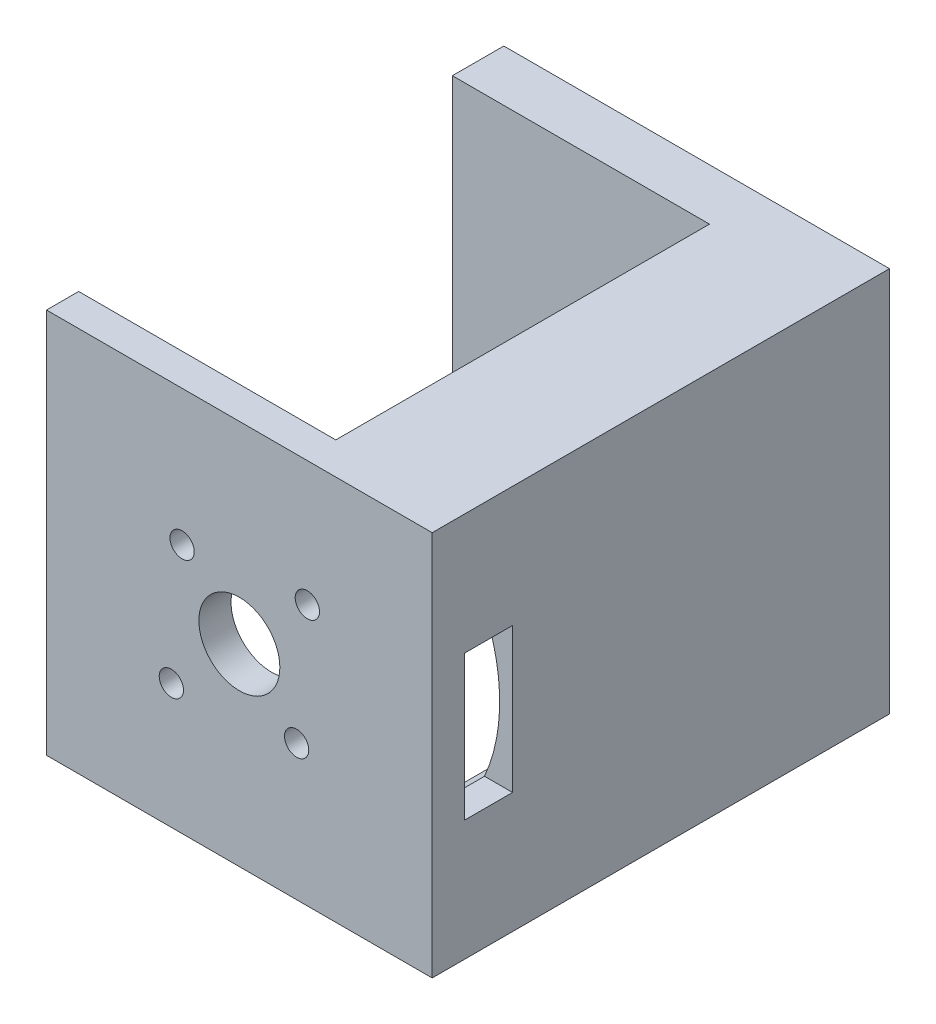
ISO-10303-21;
HEADER;
FILE_DESCRIPTION(('STEP AP214'),'2;1');
FILE_NAME('part.step','',(''),(''),'','','');
FILE_SCHEMA(('AUTOMOTIVE_DESIGN { 1 0 10303 214 1 1 1 1 }'));
ENDSEC;
DATA;
#1=APPLICATION_CONTEXT('core data for automotive mechanical design processes');
#2=APPLICATION_PROTOCOL_DEFINITION('international standard','automotive_design',2000,#1);
#3=PRODUCT_CONTEXT('',#1,'mechanical');
#4=PRODUCT('Part','Part','',(#3));
#5=PRODUCT_RELATED_PRODUCT_CATEGORY('part','',(#4));
#6=PRODUCT_DEFINITION_FORMATION('','',#4);
#7=PRODUCT_DEFINITION_CONTEXT('part definition',#1,'design');
#8=PRODUCT_DEFINITION('design','',#6,#7);
#9=PRODUCT_DEFINITION_SHAPE('','',#8);
#10=(LENGTH_UNIT() NAMED_UNIT(*) SI_UNIT(.MILLI.,.METRE.));
#11=(NAMED_UNIT(*) PLANE_ANGLE_UNIT() SI_UNIT($,.RADIAN.));
#12=(NAMED_UNIT(*) SI_UNIT($,.STERADIAN.) SOLID_ANGLE_UNIT());
#13=UNCERTAINTY_MEASURE_WITH_UNIT(LENGTH_MEASURE(1.E-05),#10,'distance_accuracy_value','');
#14=(GEOMETRIC_REPRESENTATION_CONTEXT(3) GLOBAL_UNCERTAINTY_ASSIGNED_CONTEXT((#13)) GLOBAL_UNIT_ASSIGNED_CONTEXT((#10,
#11,#12)) REPRESENTATION_CONTEXT('',''));
#15=CARTESIAN_POINT('',(0.,0.,0.));
#16=DIRECTION('',(0.,0.,1.));
#17=DIRECTION('',(1.,0.,0.));
#18=AXIS2_PLACEMENT_3D('',#15,#16,#17);
#19=CARTESIAN_POINT('',(0.,0.,3.175));
#20=DIRECTION('',(0.,0.,1.));
#21=DIRECTION('',(1.,0.,0.));
#22=AXIS2_PLACEMENT_3D('',#19,#20,#21);
#23=PLANE('',#22);
#24=CARTESIAN_POINT('',(-5.656854249492,5.656854249493,3.175));
#25=DIRECTION('',(0.,0.,1.));
#26=DIRECTION('',(1.,0.,0.));
#27=AXIS2_PLACEMENT_3D('',#24,#25,#26);
#28=CIRCLE('',#27,1.2);
#29=CARTESIAN_POINT('',(-4.456854249492,5.656854249493,3.175));
#30=VERTEX_POINT('',#29);
#31=EDGE_CURVE('E236',#30,#30,#28,.T.);
#32=ORIENTED_EDGE('',*,*,#31,.F.);
#33=EDGE_LOOP('',(#32));
#34=FACE_BOUND('',#33,.T.);
#35=CARTESIAN_POINT('',(5.656854249492,-5.656854249492,3.175));
#36=DIRECTION('',(0.,0.,1.));
#37=DIRECTION('',(1.,0.,0.));
#38=AXIS2_PLACEMENT_3D('',#35,#36,#37);
#39=CIRCLE('',#38,1.2);
#40=CARTESIAN_POINT('',(6.856854249492,-5.656854249492,3.175));
#41=VERTEX_POINT('',#40);
#42=EDGE_CURVE('E248',#41,#41,#39,.T.);
#43=ORIENTED_EDGE('',*,*,#42,.F.);
#44=EDGE_LOOP('',(#43));
#45=FACE_BOUND('',#44,.T.);
#46=DIRECTION('',(0.,-1.,0.));
#47=VECTOR('',#46,1.);
#48=CARTESIAN_POINT('',(-19.05,19.05,3.175));
#49=LINE('',#48,#47);
#50=CARTESIAN_POINT('',(-19.05,19.05,3.175));
#51=VERTEX_POINT('',#50);
#52=CARTESIAN_POINT('',(-19.05,-19.05,3.175));
#53=VERTEX_POINT('',#52);
#54=EDGE_CURVE('E260',#51,#53,#49,.T.);
#55=ORIENTED_EDGE('',*,*,#54,.T.);
#56=DIRECTION('',(1.,0.,0.));
#57=VECTOR('',#56,1.);
#58=CARTESIAN_POINT('',(-19.05,-19.05,3.175));
#59=LINE('',#58,#57);
#60=CARTESIAN_POINT('',(19.05,-19.05,3.175));
#61=VERTEX_POINT('',#60);
#62=EDGE_CURVE('E263',#53,#61,#59,.T.);
#63=ORIENTED_EDGE('',*,*,#62,.T.);
#64=DIRECTION('',(0.,1.,0.));
#65=VECTOR('',#64,1.);
#66=CARTESIAN_POINT('',(19.05,19.05,3.175));
#67=LINE('',#66,#65);
#68=CARTESIAN_POINT('',(19.05,19.05,3.175));
#69=VERTEX_POINT('',#68);
#70=EDGE_CURVE('E266',#61,#69,#67,.T.);
#71=ORIENTED_EDGE('',*,*,#70,.T.);
#72=DIRECTION('',(-1.,0.,0.));
#73=VECTOR('',#72,1.);
#74=CARTESIAN_POINT('',(-19.05,19.05,3.175));
#75=LINE('',#74,#73);
#76=EDGE_CURVE('E268',#69,#51,#75,.T.);
#77=ORIENTED_EDGE('',*,*,#76,.T.);
#78=EDGE_LOOP('',(#55,#63,#71,#77));
#79=FACE_BOUND('',#78,.T.);
#80=CARTESIAN_POINT('',(6.717514421273,6.717514421272,3.175));
#81=DIRECTION('',(0.,0.,1.));
#82=DIRECTION('',(1.,0.,0.));
#83=AXIS2_PLACEMENT_3D('',#80,#81,#82);
#84=CIRCLE('',#83,1.2);
#85=CARTESIAN_POINT('',(7.917514421273,6.717514421272,3.175));
#86=VERTEX_POINT('',#85);
#87=EDGE_CURVE('E254',#86,#86,#84,.T.);
#88=ORIENTED_EDGE('',*,*,#87,.F.);
#89=EDGE_LOOP('',(#88));
#90=FACE_BOUND('',#89,.T.);
#91=CARTESIAN_POINT('',(-6.717514421272,-6.717514421272,3.175));
#92=DIRECTION('',(0.,0.,1.));
#93=DIRECTION('',(1.,0.,0.));
#94=AXIS2_PLACEMENT_3D('',#91,#92,#93);
#95=CIRCLE('',#94,1.2);
#96=CARTESIAN_POINT('',(-5.517514421272,-6.717514421272,3.175));
#97=VERTEX_POINT('',#96);
#98=EDGE_CURVE('E242',#97,#97,#95,.T.);
#99=ORIENTED_EDGE('',*,*,#98,.F.);
#100=EDGE_LOOP('',(#99));
#101=FACE_BOUND('',#100,.T.);
#102=CARTESIAN_POINT('',(0.,0.,3.175));
#103=DIRECTION('',(0.,0.,1.));
#104=DIRECTION('',(1.,0.,0.));
#105=AXIS2_PLACEMENT_3D('',#102,#103,#104);
#106=CIRCLE('',#105,4.);
#107=CARTESIAN_POINT('',(4.,0.,3.175));
#108=VERTEX_POINT('',#107);
#109=EDGE_CURVE('E230',#108,#108,#106,.T.);
#110=ORIENTED_EDGE('',*,*,#109,.F.);
#111=EDGE_LOOP('',(#110));
#112=FACE_BOUND('',#111,.T.);
#113=ADVANCED_FACE('F43',(#34,#45,#79,#90,#101,#112),#23,.T.);
#114=CARTESIAN_POINT('',(0.,0.,0.));
#115=DIRECTION('',(0.,0.,1.));
#116=DIRECTION('',(1.,0.,0.));
#117=AXIS2_PLACEMENT_3D('',#114,#115,#116);
#118=PLANE('',#117);
#119=CARTESIAN_POINT('',(6.717514421273,6.717514421272,0.));
#120=DIRECTION('',(0.,0.,1.));
#121=DIRECTION('',(1.,0.,0.));
#122=AXIS2_PLACEMENT_3D('',#119,#120,#121);
#123=CIRCLE('',#122,1.2);
#124=CARTESIAN_POINT('',(7.917514421273,6.717514421272,0.));
#125=VERTEX_POINT('',#124);
#126=EDGE_CURVE('E251',#125,#125,#123,.T.);
#127=ORIENTED_EDGE('',*,*,#126,.T.);
#128=EDGE_LOOP('',(#127));
#129=FACE_BOUND('',#128,.T.);
#130=CARTESIAN_POINT('',(-6.717514421272,-6.717514421272,0.));
#131=DIRECTION('',(0.,0.,1.));
#132=DIRECTION('',(1.,0.,0.));
#133=AXIS2_PLACEMENT_3D('',#130,#131,#132);
#134=CIRCLE('',#133,1.2);
#135=CARTESIAN_POINT('',(-5.517514421272,-6.717514421272,0.));
#136=VERTEX_POINT('',#135);
#137=EDGE_CURVE('E239',#136,#136,#134,.T.);
#138=ORIENTED_EDGE('',*,*,#137,.T.);
#139=EDGE_LOOP('',(#138));
#140=FACE_BOUND('',#139,.T.);
#141=DIRECTION('',(1.,0.,0.));
#142=VECTOR('',#141,1.);
#143=CARTESIAN_POINT('',(-19.05,-19.05,0.));
#144=LINE('',#143,#142);
#145=CARTESIAN_POINT('',(-19.05,-19.05,0.));
#146=VERTEX_POINT('',#145);
#147=CARTESIAN_POINT('',(6.35000000000006,-19.05,0.));
#148=VERTEX_POINT('',#147);
#149=EDGE_CURVE('E272',#146,#148,#144,.T.);
#150=ORIENTED_EDGE('',*,*,#149,.F.);
#151=DIRECTION('',(0.,-1.,0.));
#152=VECTOR('',#151,1.);
#153=CARTESIAN_POINT('',(-19.05,19.05,0.));
#154=LINE('',#153,#152);
#155=CARTESIAN_POINT('',(-19.05,19.05,0.));
#156=VERTEX_POINT('',#155);
#157=EDGE_CURVE('E257',#156,#146,#154,.T.);
#158=ORIENTED_EDGE('',*,*,#157,.F.);
#159=DIRECTION('',(-1.,0.,0.));
#160=VECTOR('',#159,1.);
#161=CARTESIAN_POINT('',(-19.05,19.05,0.));
#162=LINE('',#161,#160);
#163=CARTESIAN_POINT('',(6.35,19.05,0.));
#164=VERTEX_POINT('',#163);
#165=EDGE_CURVE('E264',#164,#156,#162,.T.);
#166=ORIENTED_EDGE('',*,*,#165,.F.);
#167=DIRECTION('',(0.,1.,0.));
#168=VECTOR('',#167,1.);
#169=CARTESIAN_POINT('',(6.35000000000001,0.,0.));
#170=LINE('',#169,#168);
#171=CARTESIAN_POINT('',(6.35,16.60740497489,0.));
#172=VERTEX_POINT('',#171);
#173=EDGE_CURVE('E205',#172,#164,#170,.T.);
#174=ORIENTED_EDGE('',*,*,#173,.F.);
#175=CARTESIAN_POINT('',(0.,0.,0.));
#176=DIRECTION('',(0.,0.,-1.));
#177=DIRECTION('',(-1.,0.,0.));
#178=AXIS2_PLACEMENT_3D('',#175,#176,#177);
#179=CIRCLE('',#178,17.78);
#180=CARTESIAN_POINT('',(16.2817454819039,7.14375,0.));
#181=VERTEX_POINT('',#180);
#182=EDGE_CURVE('E204',#172,#181,#179,.T.);
#183=ORIENTED_EDGE('',*,*,#182,.T.);
#184=DIRECTION('',(1.,0.,0.));
#185=VECTOR('',#184,1.);
#186=CARTESIAN_POINT('',(-19.05,7.14375,0.));
#187=LINE('',#186,#185);
#188=CARTESIAN_POINT('',(19.05,7.14375,0.));
#189=VERTEX_POINT('',#188);
#190=EDGE_CURVE('E166',#181,#189,#187,.T.);
#191=ORIENTED_EDGE('',*,*,#190,.T.);
#192=DIRECTION('',(0.,-1.,0.));
#193=VECTOR('',#192,1.);
#194=CARTESIAN_POINT('',(19.05,7.14375,0.));
#195=LINE('',#194,#193);
#196=CARTESIAN_POINT('',(19.05,-7.14375,0.));
#197=VERTEX_POINT('',#196);
#198=EDGE_CURVE('E58',#189,#197,#195,.T.);
#199=ORIENTED_EDGE('',*,*,#198,.T.);
#200=DIRECTION('',(1.,0.,0.));
#201=VECTOR('',#200,1.);
#202=CARTESIAN_POINT('',(-19.05,-7.14375,0.));
#203=LINE('',#202,#201);
#204=CARTESIAN_POINT('',(16.2817454819039,-7.14375,0.));
#205=VERTEX_POINT('',#204);
#206=EDGE_CURVE('E151',#205,#197,#203,.T.);
#207=ORIENTED_EDGE('',*,*,#206,.F.);
#208=CARTESIAN_POINT('',(6.35000000000006,-16.6074049748899,0.));
#209=VERTEX_POINT('',#208);
#210=EDGE_CURVE('E212',#205,#209,#179,.T.);
#211=ORIENTED_EDGE('',*,*,#210,.T.);
#212=DIRECTION('',(0.,-1.,0.));
#213=VECTOR('',#212,1.);
#214=CARTESIAN_POINT('',(6.35000000000007,0.,0.));
#215=LINE('',#214,#213);
#216=EDGE_CURVE('E201',#209,#148,#215,.T.);
#217=ORIENTED_EDGE('',*,*,#216,.T.);
#218=EDGE_LOOP('',(#150,#158,#166,#174,#183,#191,#199,#207,#211,#217));
#219=FACE_BOUND('',#218,.T.);
#220=CARTESIAN_POINT('',(5.656854249492,-5.656854249492,0.));
#221=DIRECTION('',(0.,0.,1.));
#222=DIRECTION('',(1.,0.,0.));
#223=AXIS2_PLACEMENT_3D('',#220,#221,#222);
#224=CIRCLE('',#223,1.2);
#225=CARTESIAN_POINT('',(6.856854249492,-5.656854249492,0.));
#226=VERTEX_POINT('',#225);
#227=EDGE_CURVE('E245',#226,#226,#224,.T.);
#228=ORIENTED_EDGE('',*,*,#227,.T.);
#229=EDGE_LOOP('',(#228));
#230=FACE_BOUND('',#229,.T.);
#231=CARTESIAN_POINT('',(-5.656854249492,5.656854249493,0.));
#232=DIRECTION('',(0.,0.,1.));
#233=DIRECTION('',(1.,0.,0.));
#234=AXIS2_PLACEMENT_3D('',#231,#232,#233);
#235=CIRCLE('',#234,1.2);
#236=CARTESIAN_POINT('',(-4.456854249492,5.656854249493,0.));
#237=VERTEX_POINT('',#236);
#238=EDGE_CURVE('E233',#237,#237,#235,.T.);
#239=ORIENTED_EDGE('',*,*,#238,.T.);
#240=EDGE_LOOP('',(#239));
#241=FACE_BOUND('',#240,.T.);
#242=CARTESIAN_POINT('',(0.,0.,0.));
#243=DIRECTION('',(0.,0.,1.));
#244=DIRECTION('',(1.,0.,0.));
#245=AXIS2_PLACEMENT_3D('',#242,#243,#244);
#246=CIRCLE('',#245,4.);
#247=CARTESIAN_POINT('',(4.,0.,0.));
#248=VERTEX_POINT('',#247);
#249=EDGE_CURVE('E229',#248,#248,#246,.T.);
#250=ORIENTED_EDGE('',*,*,#249,.T.);
#251=EDGE_LOOP('',(#250));
#252=FACE_BOUND('',#251,.T.);
#253=ADVANCED_FACE('F289',(#129,#140,#219,#230,#241,#252),#118,.F.);
#254=CARTESIAN_POINT('',(-19.05,19.05,3.175));
#255=DIRECTION('',(1.,0.,0.));
#256=DIRECTION('',(0.,1.,0.));
#257=AXIS2_PLACEMENT_3D('',#254,#255,#256);
#258=PLANE('',#257);
#259=ORIENTED_EDGE('',*,*,#157,.T.);
#260=DIRECTION('',(0.,0.,-1.));
#261=VECTOR('',#260,1.);
#262=CARTESIAN_POINT('',(-19.05,-19.05,3.175));
#263=LINE('',#262,#261);
#264=EDGE_CURVE('E282',#53,#146,#263,.T.);
#265=ORIENTED_EDGE('',*,*,#264,.F.);
#266=ORIENTED_EDGE('',*,*,#54,.F.);
#267=DIRECTION('',(0.,0.,-1.));
#268=VECTOR('',#267,1.);
#269=CARTESIAN_POINT('',(-19.05,19.05,3.175));
#270=LINE('',#269,#268);
#271=EDGE_CURVE('E270',#51,#156,#270,.T.);
#272=ORIENTED_EDGE('',*,*,#271,.T.);
#273=EDGE_LOOP('',(#259,#265,#266,#272));
#274=FACE_BOUND('',#273,.T.);
#275=ADVANCED_FACE('F45',(#274),#258,.F.);
#276=CARTESIAN_POINT('',(-19.05,-19.05,3.175));
#277=DIRECTION('',(0.,1.,0.));
#278=DIRECTION('',(0.,0.,1.));
#279=AXIS2_PLACEMENT_3D('',#276,#277,#278);
#280=PLANE('',#279);
#281=ORIENTED_EDGE('',*,*,#149,.T.);
#282=DIRECTION('',(0.,0.,1.));
#283=VECTOR('',#282,1.);
#284=CARTESIAN_POINT('',(6.35000000000006,-19.05,-82.1609262841384));
#285=LINE('',#284,#283);
#286=CARTESIAN_POINT('',(6.35000000000006,-19.05,-36.92));
#287=VERTEX_POINT('',#286);
#288=EDGE_CURVE('E215',#287,#148,#285,.T.);
#289=ORIENTED_EDGE('',*,*,#288,.F.);
#290=DIRECTION('',(1.,0.,0.));
#291=VECTOR('',#290,1.);
#292=CARTESIAN_POINT('',(0.,-19.05,-36.92));
#293=LINE('',#292,#291);
#294=CARTESIAN_POINT('',(-19.05,-19.05,-36.92));
#295=VERTEX_POINT('',#294);
#296=EDGE_CURVE('E189',#295,#287,#293,.T.);
#297=ORIENTED_EDGE('',*,*,#296,.F.);
#298=DIRECTION('',(0.,0.,1.));
#299=VECTOR('',#298,1.);
#300=CARTESIAN_POINT('',(-19.05,-19.05,-42.));
#301=LINE('',#300,#299);
#302=CARTESIAN_POINT('',(-19.05,-19.05,-42.));
#303=VERTEX_POINT('',#302);
#304=EDGE_CURVE('E198',#303,#295,#301,.T.);
#305=ORIENTED_EDGE('',*,*,#304,.F.);
#306=DIRECTION('',(1.,0.,0.));
#307=VECTOR('',#306,1.);
#308=CARTESIAN_POINT('',(0.,-19.05,-42.));
#309=LINE('',#308,#307);
#310=CARTESIAN_POINT('',(19.05,-19.05,-42.));
#311=VERTEX_POINT('',#310);
#312=EDGE_CURVE('E178',#303,#311,#309,.T.);
#313=ORIENTED_EDGE('',*,*,#312,.T.);
#314=DIRECTION('',(0.,0.,-1.));
#315=VECTOR('',#314,1.);
#316=CARTESIAN_POINT('',(19.05,-19.05,3.175));
#317=LINE('',#316,#315);
#318=EDGE_CURVE('E280',#61,#311,#317,.T.);
#319=ORIENTED_EDGE('',*,*,#318,.F.);
#320=ORIENTED_EDGE('',*,*,#62,.F.);
#321=ORIENTED_EDGE('',*,*,#264,.T.);
#322=EDGE_LOOP('',(#281,#289,#297,#305,#313,#319,#320,#321));
#323=FACE_BOUND('',#322,.T.);
#324=ADVANCED_FACE('F301',(#323),#280,.F.);
#325=CARTESIAN_POINT('',(19.05,19.05,3.175));
#326=DIRECTION('',(-1.,0.,0.));
#327=DIRECTION('',(0.,0.,1.));
#328=AXIS2_PLACEMENT_3D('',#325,#326,#327);
#329=PLANE('',#328);
#330=DIRECTION('',(0.,0.,-1.));
#331=VECTOR('',#330,1.);
#332=CARTESIAN_POINT('',(19.05,-7.14375,0.));
#333=LINE('',#332,#331);
#334=CARTESIAN_POINT('',(19.05,-7.14375,-4.7625));
#335=VERTEX_POINT('',#334);
#336=EDGE_CURVE('E154',#197,#335,#333,.T.);
#337=ORIENTED_EDGE('',*,*,#336,.F.);
#338=ORIENTED_EDGE('',*,*,#198,.F.);
#339=DIRECTION('',(0.,0.,1.));
#340=VECTOR('',#339,1.);
#341=CARTESIAN_POINT('',(19.05,7.14375,0.));
#342=LINE('',#341,#340);
#343=CARTESIAN_POINT('',(19.05,7.14375,-4.7625));
#344=VERTEX_POINT('',#343);
#345=EDGE_CURVE('E161',#344,#189,#342,.T.);
#346=ORIENTED_EDGE('',*,*,#345,.F.);
#347=DIRECTION('',(0.,1.,0.));
#348=VECTOR('',#347,1.);
#349=CARTESIAN_POINT('',(19.05,7.14375,-4.7625));
#350=LINE('',#349,#348);
#351=EDGE_CURVE('E146',#335,#344,#350,.T.);
#352=ORIENTED_EDGE('',*,*,#351,.F.);
#353=EDGE_LOOP('',(#337,#338,#346,#352));
#354=FACE_BOUND('',#353,.T.);
#355=ORIENTED_EDGE('',*,*,#318,.T.);
#356=DIRECTION('',(0.,-1.,0.));
#357=VECTOR('',#356,1.);
#358=CARTESIAN_POINT('',(19.05,0.,-42.));
#359=LINE('',#358,#357);
#360=CARTESIAN_POINT('',(19.05,19.05,-42.));
#361=VERTEX_POINT('',#360);
#362=EDGE_CURVE('E174',#361,#311,#359,.T.);
#363=ORIENTED_EDGE('',*,*,#362,.F.);
#364=DIRECTION('',(0.,0.,-1.));
#365=VECTOR('',#364,1.);
#366=CARTESIAN_POINT('',(19.05,19.05,3.175));
#367=LINE('',#366,#365);
#368=EDGE_CURVE('E278',#69,#361,#367,.T.);
#369=ORIENTED_EDGE('',*,*,#368,.F.);
#370=ORIENTED_EDGE('',*,*,#70,.F.);
#371=EDGE_LOOP('',(#355,#363,#369,#370));
#372=FACE_BOUND('',#371,.T.);
#373=ADVANCED_FACE('F158',(#354,#372),#329,.F.);
#374=CARTESIAN_POINT('',(-19.05,19.05,3.175));
#375=DIRECTION('',(0.,-1.,0.));
#376=DIRECTION('',(0.,0.,-1.));
#377=AXIS2_PLACEMENT_3D('',#374,#375,#376);
#378=PLANE('',#377);
#379=ORIENTED_EDGE('',*,*,#368,.T.);
#380=DIRECTION('',(-1.,0.,0.));
#381=VECTOR('',#380,1.);
#382=CARTESIAN_POINT('',(0.,19.05,-42.));
#383=LINE('',#382,#381);
#384=CARTESIAN_POINT('',(-19.05,19.05,-42.));
#385=VERTEX_POINT('',#384);
#386=EDGE_CURVE('E171',#361,#385,#383,.T.);
#387=ORIENTED_EDGE('',*,*,#386,.T.);
#388=DIRECTION('',(0.,0.,1.));
#389=VECTOR('',#388,1.);
#390=CARTESIAN_POINT('',(-19.05,19.05,-42.));
#391=LINE('',#390,#389);
#392=CARTESIAN_POINT('',(-19.05,19.05,-36.92));
#393=VERTEX_POINT('',#392);
#394=EDGE_CURVE('E187',#385,#393,#391,.T.);
#395=ORIENTED_EDGE('',*,*,#394,.T.);
#396=DIRECTION('',(-1.,0.,0.));
#397=VECTOR('',#396,1.);
#398=CARTESIAN_POINT('',(0.,19.05,-36.92));
#399=LINE('',#398,#397);
#400=CARTESIAN_POINT('',(6.35,19.05,-36.92));
#401=VERTEX_POINT('',#400);
#402=EDGE_CURVE('E168',#401,#393,#399,.T.);
#403=ORIENTED_EDGE('',*,*,#402,.F.);
#404=DIRECTION('',(0.,0.,1.));
#405=VECTOR('',#404,1.);
#406=CARTESIAN_POINT('',(6.35,19.05,-82.1609262841384));
#407=LINE('',#406,#405);
#408=EDGE_CURVE('E222',#401,#164,#407,.T.);
#409=ORIENTED_EDGE('',*,*,#408,.T.);
#410=ORIENTED_EDGE('',*,*,#165,.T.);
#411=ORIENTED_EDGE('',*,*,#271,.F.);
#412=ORIENTED_EDGE('',*,*,#76,.F.);
#413=EDGE_LOOP('',(#379,#387,#395,#403,#409,#410,#411,#412));
#414=FACE_BOUND('',#413,.T.);
#415=ADVANCED_FACE('F311',(#414),#378,.F.);
#416=CARTESIAN_POINT('',(6.717514421273,6.717514421272,3.175));
#417=DIRECTION('',(0.,0.,-1.));
#418=DIRECTION('',(-1.,0.,0.));
#419=AXIS2_PLACEMENT_3D('',#416,#417,#418);
#420=CYLINDRICAL_SURFACE('',#419,1.2);
#421=ORIENTED_EDGE('',*,*,#126,.F.);
#422=EDGE_LOOP('',(#421));
#423=FACE_BOUND('',#422,.T.);
#424=ORIENTED_EDGE('',*,*,#87,.T.);
#425=EDGE_LOOP('',(#424));
#426=FACE_BOUND('',#425,.T.);
#427=ADVANCED_FACE('F342',(#423,#426),#420,.F.);
#428=CARTESIAN_POINT('',(5.656854249492,-5.656854249492,3.175));
#429=DIRECTION('',(0.,0.,-1.));
#430=DIRECTION('',(-1.,0.,0.));
#431=AXIS2_PLACEMENT_3D('',#428,#429,#430);
#432=CYLINDRICAL_SURFACE('',#431,1.2);
#433=ORIENTED_EDGE('',*,*,#227,.F.);
#434=EDGE_LOOP('',(#433));
#435=FACE_BOUND('',#434,.T.);
#436=ORIENTED_EDGE('',*,*,#42,.T.);
#437=EDGE_LOOP('',(#436));
#438=FACE_BOUND('',#437,.T.);
#439=ADVANCED_FACE('F372',(#435,#438),#432,.F.);
#440=CARTESIAN_POINT('',(-6.717514421272,-6.717514421272,3.175));
#441=DIRECTION('',(0.,0.,-1.));
#442=DIRECTION('',(-1.,0.,0.));
#443=AXIS2_PLACEMENT_3D('',#440,#441,#442);
#444=CYLINDRICAL_SURFACE('',#443,1.2);
#445=ORIENTED_EDGE('',*,*,#137,.F.);
#446=EDGE_LOOP('',(#445));
#447=FACE_BOUND('',#446,.T.);
#448=ORIENTED_EDGE('',*,*,#98,.T.);
#449=EDGE_LOOP('',(#448));
#450=FACE_BOUND('',#449,.T.);
#451=ADVANCED_FACE('F378',(#447,#450),#444,.F.);
#452=CARTESIAN_POINT('',(-5.656854249492,5.656854249493,3.175));
#453=DIRECTION('',(0.,0.,-1.));
#454=DIRECTION('',(-1.,0.,0.));
#455=AXIS2_PLACEMENT_3D('',#452,#453,#454);
#456=CYLINDRICAL_SURFACE('',#455,1.2);
#457=ORIENTED_EDGE('',*,*,#238,.F.);
#458=EDGE_LOOP('',(#457));
#459=FACE_BOUND('',#458,.T.);
#460=ORIENTED_EDGE('',*,*,#31,.T.);
#461=EDGE_LOOP('',(#460));
#462=FACE_BOUND('',#461,.T.);
#463=ADVANCED_FACE('F381',(#459,#462),#456,.F.);
#464=CARTESIAN_POINT('',(0.,0.,3.175));
#465=DIRECTION('',(0.,0.,-1.));
#466=DIRECTION('',(-1.,0.,0.));
#467=AXIS2_PLACEMENT_3D('',#464,#465,#466);
#468=CYLINDRICAL_SURFACE('',#467,4.);
#469=ORIENTED_EDGE('',*,*,#249,.F.);
#470=EDGE_LOOP('',(#469));
#471=FACE_BOUND('',#470,.T.);
#472=ORIENTED_EDGE('',*,*,#109,.T.);
#473=EDGE_LOOP('',(#472));
#474=FACE_BOUND('',#473,.T.);
#475=ADVANCED_FACE('F438',(#471,#474),#468,.F.);
#476=CARTESIAN_POINT('',(6.35000000000007,0.,-82.1609262841384));
#477=DIRECTION('',(-1.,0.,0.));
#478=DIRECTION('',(0.,-1.,0.));
#479=AXIS2_PLACEMENT_3D('',#476,#477,#478);
#480=PLANE('',#479);
#481=DIRECTION('',(0.,0.,1.));
#482=VECTOR('',#481,1.);
#483=CARTESIAN_POINT('',(6.35000000000006,-16.6074049748899,-82.1609262841384));
#484=LINE('',#483,#482);
#485=CARTESIAN_POINT('',(6.35000000000006,-16.6074049748899,-36.92));
#486=VERTEX_POINT('',#485);
#487=EDGE_CURVE('E218',#486,#209,#484,.T.);
#488=ORIENTED_EDGE('',*,*,#487,.F.);
#489=DIRECTION('',(0.,-1.,0.));
#490=VECTOR('',#489,1.);
#491=CARTESIAN_POINT('',(6.35000000000007,0.,-36.92));
#492=LINE('',#491,#490);
#493=EDGE_CURVE('E203',#486,#287,#492,.T.);
#494=ORIENTED_EDGE('',*,*,#493,.T.);
#495=ORIENTED_EDGE('',*,*,#288,.T.);
#496=ORIENTED_EDGE('',*,*,#216,.F.);
#497=EDGE_LOOP('',(#488,#494,#495,#496));
#498=FACE_BOUND('',#497,.T.);
#499=ADVANCED_FACE('F297',(#498),#480,.T.);
#500=CARTESIAN_POINT('',(6.35000000000001,0.,-82.1609262841384));
#501=DIRECTION('',(1.,0.,0.));
#502=DIRECTION('',(0.,1.,0.));
#503=AXIS2_PLACEMENT_3D('',#500,#501,#502);
#504=PLANE('',#503);
#505=DIRECTION('',(0.,1.,0.));
#506=VECTOR('',#505,1.);
#507=CARTESIAN_POINT('',(6.35000000000001,0.,-36.92));
#508=LINE('',#507,#506);
#509=CARTESIAN_POINT('',(6.35,16.60740497489,-36.92));
#510=VERTEX_POINT('',#509);
#511=EDGE_CURVE('E200',#510,#401,#508,.T.);
#512=ORIENTED_EDGE('',*,*,#511,.F.);
#513=DIRECTION('',(0.,0.,1.));
#514=VECTOR('',#513,1.);
#515=CARTESIAN_POINT('',(6.35,16.60740497489,-82.1609262841384));
#516=LINE('',#515,#514);
#517=EDGE_CURVE('E209',#510,#172,#516,.T.);
#518=ORIENTED_EDGE('',*,*,#517,.T.);
#519=ORIENTED_EDGE('',*,*,#173,.T.);
#520=ORIENTED_EDGE('',*,*,#408,.F.);
#521=EDGE_LOOP('',(#512,#518,#519,#520));
#522=FACE_BOUND('',#521,.T.);
#523=ADVANCED_FACE('F314',(#522),#504,.F.);
#524=CARTESIAN_POINT('',(0.,0.,-82.1609262841384));
#525=DIRECTION('',(0.,0.,1.));
#526=DIRECTION('',(1.,0.,0.));
#527=AXIS2_PLACEMENT_3D('',#524,#525,#526);
#528=CYLINDRICAL_SURFACE('',#527,17.78);
#529=DIRECTION('',(0.,0.,1.));
#530=VECTOR('',#529,1.);
#531=CARTESIAN_POINT('',(16.281745481904,7.14375,-82.1609262841384));
#532=LINE('',#531,#530);
#533=CARTESIAN_POINT('',(16.281745481904,7.14375,-4.7625));
#534=VERTEX_POINT('',#533);
#535=EDGE_CURVE('E11',#181,#534,#532,.F.);
#536=ORIENTED_EDGE('',*,*,#535,.F.);
#537=ORIENTED_EDGE('',*,*,#182,.F.);
#538=ORIENTED_EDGE('',*,*,#517,.F.);
#539=CARTESIAN_POINT('',(0.,0.,-36.92));
#540=DIRECTION('',(0.,0.,-1.));
#541=DIRECTION('',(-1.,0.,0.));
#542=AXIS2_PLACEMENT_3D('',#539,#540,#541);
#543=CIRCLE('',#542,17.78);
#544=EDGE_CURVE('E208',#510,#486,#543,.T.);
#545=ORIENTED_EDGE('',*,*,#544,.T.);
#546=ORIENTED_EDGE('',*,*,#487,.T.);
#547=ORIENTED_EDGE('',*,*,#210,.F.);
#548=DIRECTION('',(0.,0.,1.));
#549=VECTOR('',#548,1.);
#550=CARTESIAN_POINT('',(16.281745481904,-7.14375,-82.1609262841384));
#551=LINE('',#550,#549);
#552=CARTESIAN_POINT('',(16.281745481904,-7.14375,-4.7625));
#553=VERTEX_POINT('',#552);
#554=EDGE_CURVE('E285',#553,#205,#551,.T.);
#555=ORIENTED_EDGE('',*,*,#554,.F.);
#556=CARTESIAN_POINT('',(0.,0.,-4.7625));
#557=DIRECTION('',(0.,0.,-1.));
#558=DIRECTION('',(-1.,0.,0.));
#559=AXIS2_PLACEMENT_3D('',#556,#557,#558);
#560=CIRCLE('',#559,17.78);
#561=EDGE_CURVE('E51',#534,#553,#560,.T.);
#562=ORIENTED_EDGE('',*,*,#561,.F.);
#563=EDGE_LOOP('',(#536,#537,#538,#545,#546,#547,#555,#562));
#564=FACE_BOUND('',#563,.T.);
#565=ADVANCED_FACE('F292',(#564),#528,.F.);
#566=CARTESIAN_POINT('',(0.,0.,-36.92));
#567=DIRECTION('',(0.,0.,-1.));
#568=DIRECTION('',(-1.,0.,0.));
#569=AXIS2_PLACEMENT_3D('',#566,#567,#568);
#570=PLANE('',#569);
#571=CARTESIAN_POINT('',(0.,0.,-36.92));
#572=DIRECTION('',(0.,0.,-1.));
#573=DIRECTION('',(-1.,0.,0.));
#574=AXIS2_PLACEMENT_3D('',#571,#572,#573);
#575=CIRCLE('',#574,6.35);
#576=CARTESIAN_POINT('',(-6.35,0.,-36.92));
#577=VERTEX_POINT('',#576);
#578=EDGE_CURVE('E175',#577,#577,#575,.T.);
#579=ORIENTED_EDGE('',*,*,#578,.T.);
#580=EDGE_LOOP('',(#579));
#581=FACE_BOUND('',#580,.T.);
#582=ORIENTED_EDGE('',*,*,#544,.F.);
#583=ORIENTED_EDGE('',*,*,#511,.T.);
#584=ORIENTED_EDGE('',*,*,#402,.T.);
#585=DIRECTION('',(0.,-1.,0.));
#586=VECTOR('',#585,1.);
#587=CARTESIAN_POINT('',(-19.05,0.,-36.92));
#588=LINE('',#587,#586);
#589=EDGE_CURVE('E191',#393,#295,#588,.T.);
#590=ORIENTED_EDGE('',*,*,#589,.T.);
#591=ORIENTED_EDGE('',*,*,#296,.T.);
#592=ORIENTED_EDGE('',*,*,#493,.F.);
#593=EDGE_LOOP('',(#582,#583,#584,#590,#591,#592));
#594=FACE_BOUND('',#593,.T.);
#595=ADVANCED_FACE('F390',(#581,#594),#570,.F.);
#596=CARTESIAN_POINT('',(-19.05,0.,-42.));
#597=DIRECTION('',(-1.,0.,0.));
#598=DIRECTION('',(0.,-1.,0.));
#599=AXIS2_PLACEMENT_3D('',#596,#597,#598);
#600=PLANE('',#599);
#601=ORIENTED_EDGE('',*,*,#589,.F.);
#602=ORIENTED_EDGE('',*,*,#394,.F.);
#603=DIRECTION('',(0.,-1.,0.));
#604=VECTOR('',#603,1.);
#605=CARTESIAN_POINT('',(-19.05,0.,-42.));
#606=LINE('',#605,#604);
#607=EDGE_CURVE('E181',#385,#303,#606,.T.);
#608=ORIENTED_EDGE('',*,*,#607,.T.);
#609=ORIENTED_EDGE('',*,*,#304,.T.);
#610=EDGE_LOOP('',(#601,#602,#608,#609));
#611=FACE_BOUND('',#610,.T.);
#612=ADVANCED_FACE('F450',(#611),#600,.T.);
#613=CARTESIAN_POINT('',(0.,0.,-42.));
#614=DIRECTION('',(0.,0.,1.));
#615=DIRECTION('',(1.,0.,0.));
#616=AXIS2_PLACEMENT_3D('',#613,#614,#615);
#617=CYLINDRICAL_SURFACE('',#616,6.35);
#618=CARTESIAN_POINT('',(0.,0.,-42.));
#619=DIRECTION('',(0.,0.,-1.));
#620=DIRECTION('',(-1.,0.,0.));
#621=AXIS2_PLACEMENT_3D('',#618,#619,#620);
#622=CIRCLE('',#621,6.35);
#623=CARTESIAN_POINT('',(-6.35,0.,-42.));
#624=VERTEX_POINT('',#623);
#625=EDGE_CURVE('E184',#624,#624,#622,.T.);
#626=ORIENTED_EDGE('',*,*,#625,.T.);
#627=EDGE_LOOP('',(#626));
#628=FACE_BOUND('',#627,.T.);
#629=ORIENTED_EDGE('',*,*,#578,.F.);
#630=EDGE_LOOP('',(#629));
#631=FACE_BOUND('',#630,.T.);
#632=ADVANCED_FACE('F327',(#628,#631),#617,.F.);
#633=CARTESIAN_POINT('',(0.,0.,-42.));
#634=DIRECTION('',(0.,0.,-1.));
#635=DIRECTION('',(-1.,0.,0.));
#636=AXIS2_PLACEMENT_3D('',#633,#634,#635);
#637=PLANE('',#636);
#638=ORIENTED_EDGE('',*,*,#386,.F.);
#639=ORIENTED_EDGE('',*,*,#362,.T.);
#640=ORIENTED_EDGE('',*,*,#312,.F.);
#641=ORIENTED_EDGE('',*,*,#607,.F.);
#642=EDGE_LOOP('',(#638,#639,#640,#641));
#643=FACE_BOUND('',#642,.T.);
#644=ORIENTED_EDGE('',*,*,#625,.F.);
#645=EDGE_LOOP('',(#644));
#646=FACE_BOUND('',#645,.T.);
#647=ADVANCED_FACE('F319',(#643,#646),#637,.T.);
#648=CARTESIAN_POINT('',(-19.05,7.14375,0.));
#649=DIRECTION('',(0.,1.,0.));
#650=DIRECTION('',(0.,0.,1.));
#651=AXIS2_PLACEMENT_3D('',#648,#649,#650);
#652=PLANE('',#651);
#653=ORIENTED_EDGE('',*,*,#535,.T.);
#654=DIRECTION('',(1.,0.,0.));
#655=VECTOR('',#654,1.);
#656=CARTESIAN_POINT('',(-19.05,7.14375,-4.7625));
#657=LINE('',#656,#655);
#658=EDGE_CURVE('E150',#534,#344,#657,.T.);
#659=ORIENTED_EDGE('',*,*,#658,.T.);
#660=ORIENTED_EDGE('',*,*,#345,.T.);
#661=ORIENTED_EDGE('',*,*,#190,.F.);
#662=EDGE_LOOP('',(#653,#659,#660,#661));
#663=FACE_BOUND('',#662,.T.);
#664=ADVANCED_FACE('F317',(#663),#652,.F.);
#665=CARTESIAN_POINT('',(-19.05,7.14375,-4.7625));
#666=DIRECTION('',(0.,0.,-1.));
#667=DIRECTION('',(-1.,0.,0.));
#668=AXIS2_PLACEMENT_3D('',#665,#666,#667);
#669=PLANE('',#668);
#670=ORIENTED_EDGE('',*,*,#561,.T.);
#671=DIRECTION('',(1.,0.,0.));
#672=VECTOR('',#671,1.);
#673=CARTESIAN_POINT('',(-19.05,-7.14375,-4.7625));
#674=LINE('',#673,#672);
#675=EDGE_CURVE('E66',#553,#335,#674,.T.);
#676=ORIENTED_EDGE('',*,*,#675,.T.);
#677=ORIENTED_EDGE('',*,*,#351,.T.);
#678=ORIENTED_EDGE('',*,*,#658,.F.);
#679=EDGE_LOOP('',(#670,#676,#677,#678));
#680=FACE_BOUND('',#679,.T.);
#681=ADVANCED_FACE('F143',(#680),#669,.F.);
#682=CARTESIAN_POINT('',(-19.05,-7.14375,0.));
#683=DIRECTION('',(0.,-1.,0.));
#684=DIRECTION('',(0.,0.,-1.));
#685=AXIS2_PLACEMENT_3D('',#682,#683,#684);
#686=PLANE('',#685);
#687=ORIENTED_EDGE('',*,*,#554,.T.);
#688=ORIENTED_EDGE('',*,*,#206,.T.);
#689=ORIENTED_EDGE('',*,*,#336,.T.);
#690=ORIENTED_EDGE('',*,*,#675,.F.);
#691=EDGE_LOOP('',(#687,#688,#689,#690));
#692=FACE_BOUND('',#691,.T.);
#693=ADVANCED_FACE('F155',(#692),#686,.F.);
#694=CLOSED_SHELL('',(#113,#253,#275,#324,#373,#415,#427,#439,#451,#463,#475,#499,#523,#565,
#595,#612,#632,#647,#664,#681,#693));
#695=MANIFOLD_SOLID_BREP('B2',#694);
#696=ADVANCED_BREP_SHAPE_REPRESENTATION('',(#18,#695),#14);
#697=SHAPE_DEFINITION_REPRESENTATION(#9,#696);
ENDSEC;
END-ISO-10303-21;
